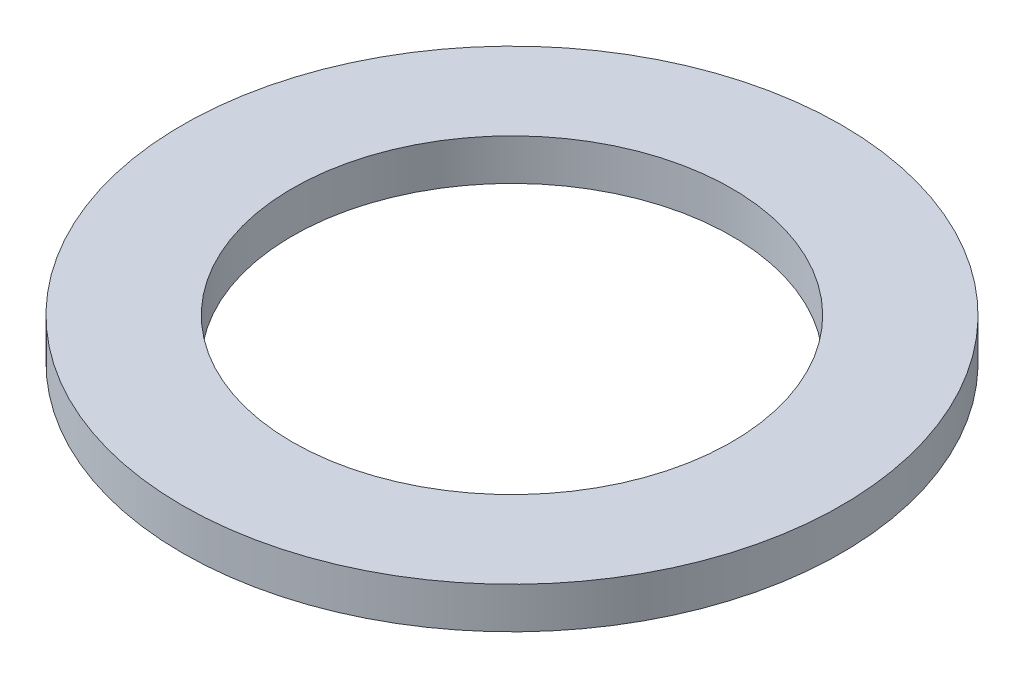
ISO-10303-21;
HEADER;
FILE_DESCRIPTION(('STEP AP214'),'2;1');
FILE_NAME('part.step','',(''),(''),'','','');
FILE_SCHEMA(('AUTOMOTIVE_DESIGN { 1 0 10303 214 1 1 1 1 }'));
ENDSEC;
DATA;
#1=APPLICATION_CONTEXT('core data for automotive mechanical design processes');
#2=APPLICATION_PROTOCOL_DEFINITION('international standard','automotive_design',2000,#1);
#3=PRODUCT_CONTEXT('',#1,'mechanical');
#4=PRODUCT('Part','Part','',(#3));
#5=PRODUCT_RELATED_PRODUCT_CATEGORY('part','',(#4));
#6=PRODUCT_DEFINITION_FORMATION('','',#4);
#7=PRODUCT_DEFINITION_CONTEXT('part definition',#1,'design');
#8=PRODUCT_DEFINITION('design','',#6,#7);
#9=PRODUCT_DEFINITION_SHAPE('','',#8);
#10=(LENGTH_UNIT() NAMED_UNIT(*) SI_UNIT(.MILLI.,.METRE.));
#11=(NAMED_UNIT(*) PLANE_ANGLE_UNIT() SI_UNIT($,.RADIAN.));
#12=(NAMED_UNIT(*) SI_UNIT($,.STERADIAN.) SOLID_ANGLE_UNIT());
#13=UNCERTAINTY_MEASURE_WITH_UNIT(LENGTH_MEASURE(1.E-05),#10,'distance_accuracy_value','');
#14=(GEOMETRIC_REPRESENTATION_CONTEXT(3) GLOBAL_UNCERTAINTY_ASSIGNED_CONTEXT((#13)) GLOBAL_UNIT_ASSIGNED_CONTEXT((#10,
#11,#12)) REPRESENTATION_CONTEXT('',''));
#15=CARTESIAN_POINT('',(0.,0.,0.));
#16=DIRECTION('',(0.,0.,1.));
#17=DIRECTION('',(1.,0.,0.));
#18=AXIS2_PLACEMENT_3D('',#15,#16,#17);
#19=CARTESIAN_POINT('',(0.,0.,0.));
#20=DIRECTION('',(0.,1.,0.));
#21=DIRECTION('',(0.,0.,1.));
#22=AXIS2_PLACEMENT_3D('',#19,#20,#21);
#23=PLANE('',#22);
#24=CARTESIAN_POINT('',(0.,0.,0.));
#25=DIRECTION('',(0.,1.,0.));
#26=DIRECTION('',(0.,0.,1.));
#27=AXIS2_PLACEMENT_3D('',#24,#25,#26);
#28=CIRCLE('',#27,12.);
#29=CARTESIAN_POINT('',(0.,0.,12.));
#30=VERTEX_POINT('',#29);
#31=EDGE_CURVE('E27',#30,#30,#28,.F.);
#32=ORIENTED_EDGE('',*,*,#31,.F.);
#33=EDGE_LOOP('',(#32));
#34=FACE_BOUND('',#33,.T.);
#35=CARTESIAN_POINT('',(0.,0.,0.));
#36=DIRECTION('',(0.,1.,0.));
#37=DIRECTION('',(0.,0.,1.));
#38=AXIS2_PLACEMENT_3D('',#35,#36,#37);
#39=CIRCLE('',#38,8.);
#40=CARTESIAN_POINT('',(0.,0.,8.));
#41=VERTEX_POINT('',#40);
#42=EDGE_CURVE('E18',#41,#41,#39,.F.);
#43=ORIENTED_EDGE('',*,*,#42,.T.);
#44=EDGE_LOOP('',(#43));
#45=FACE_BOUND('',#44,.T.);
#46=ADVANCED_FACE('F15',(#34,#45),#23,.T.);
#47=CARTESIAN_POINT('',(0.,-1.5,0.));
#48=DIRECTION('',(0.,1.,0.));
#49=DIRECTION('',(0.,0.,1.));
#50=AXIS2_PLACEMENT_3D('',#47,#48,#49);
#51=CYLINDRICAL_SURFACE('',#50,8.);
#52=CARTESIAN_POINT('',(0.,-1.5,0.));
#53=DIRECTION('',(0.,1.,0.));
#54=DIRECTION('',(0.,0.,1.));
#55=AXIS2_PLACEMENT_3D('',#52,#53,#54);
#56=CIRCLE('',#55,8.);
#57=CARTESIAN_POINT('',(0.,-1.5,8.));
#58=VERTEX_POINT('',#57);
#59=EDGE_CURVE('E22',#58,#58,#56,.F.);
#60=ORIENTED_EDGE('',*,*,#59,.T.);
#61=EDGE_LOOP('',(#60));
#62=FACE_BOUND('',#61,.T.);
#63=ORIENTED_EDGE('',*,*,#42,.F.);
#64=EDGE_LOOP('',(#63));
#65=FACE_BOUND('',#64,.T.);
#66=ADVANCED_FACE('F36',(#62,#65),#51,.F.);
#67=CARTESIAN_POINT('',(0.,-1.5,0.));
#68=DIRECTION('',(0.,1.,0.));
#69=DIRECTION('',(0.,0.,1.));
#70=AXIS2_PLACEMENT_3D('',#67,#68,#69);
#71=CYLINDRICAL_SURFACE('',#70,12.);
#72=ORIENTED_EDGE('',*,*,#31,.T.);
#73=EDGE_LOOP('',(#72));
#74=FACE_BOUND('',#73,.T.);
#75=CARTESIAN_POINT('',(0.,-1.5,0.));
#76=DIRECTION('',(0.,1.,0.));
#77=DIRECTION('',(0.,0.,1.));
#78=AXIS2_PLACEMENT_3D('',#75,#76,#77);
#79=CIRCLE('',#78,12.);
#80=CARTESIAN_POINT('',(0.,-1.5,12.));
#81=VERTEX_POINT('',#80);
#82=EDGE_CURVE('E10',#81,#81,#79,.T.);
#83=ORIENTED_EDGE('',*,*,#82,.T.);
#84=EDGE_LOOP('',(#83));
#85=FACE_BOUND('',#84,.T.);
#86=ADVANCED_FACE('F38',(#74,#85),#71,.T.);
#87=CARTESIAN_POINT('',(0.,-1.5,0.));
#88=DIRECTION('',(0.,1.,0.));
#89=DIRECTION('',(0.,0.,1.));
#90=AXIS2_PLACEMENT_3D('',#87,#88,#89);
#91=PLANE('',#90);
#92=ORIENTED_EDGE('',*,*,#82,.F.);
#93=EDGE_LOOP('',(#92));
#94=FACE_BOUND('',#93,.T.);
#95=ORIENTED_EDGE('',*,*,#59,.F.);
#96=EDGE_LOOP('',(#95));
#97=FACE_BOUND('',#96,.T.);
#98=ADVANCED_FACE('F45',(#94,#97),#91,.F.);
#99=CLOSED_SHELL('',(#46,#66,#86,#98));
#100=MANIFOLD_SOLID_BREP('B1',#99);
#101=ADVANCED_BREP_SHAPE_REPRESENTATION('',(#18,#100),#14);
#102=SHAPE_DEFINITION_REPRESENTATION(#9,#101);
ENDSEC;
END-ISO-10303-21;
